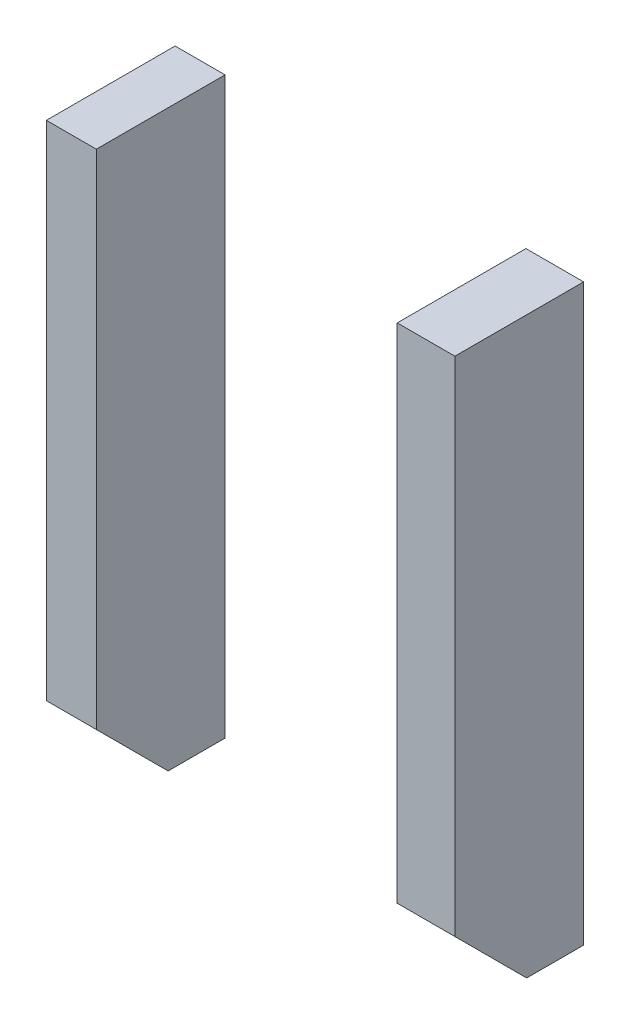
ISO-10303-21;
HEADER;
FILE_DESCRIPTION(('STEP AP214'),'2;1');
FILE_NAME('part.step','',(''),(''),'','','');
FILE_SCHEMA(('AUTOMOTIVE_DESIGN { 1 0 10303 214 1 1 1 1 }'));
ENDSEC;
DATA;
#1=APPLICATION_CONTEXT('core data for automotive mechanical design processes');
#2=APPLICATION_PROTOCOL_DEFINITION('international standard','automotive_design',2000,#1);
#3=PRODUCT_CONTEXT('',#1,'mechanical');
#4=PRODUCT('Part','Part','',(#3));
#5=PRODUCT_RELATED_PRODUCT_CATEGORY('part','',(#4));
#6=PRODUCT_DEFINITION_FORMATION('','',#4);
#7=PRODUCT_DEFINITION_CONTEXT('part definition',#1,'design');
#8=PRODUCT_DEFINITION('design','',#6,#7);
#9=PRODUCT_DEFINITION_SHAPE('','',#8);
#10=(LENGTH_UNIT() NAMED_UNIT(*) SI_UNIT(.MILLI.,.METRE.));
#11=(NAMED_UNIT(*) PLANE_ANGLE_UNIT() SI_UNIT($,.RADIAN.));
#12=(NAMED_UNIT(*) SI_UNIT($,.STERADIAN.) SOLID_ANGLE_UNIT());
#13=UNCERTAINTY_MEASURE_WITH_UNIT(LENGTH_MEASURE(1.E-05),#10,'distance_accuracy_value','');
#14=(GEOMETRIC_REPRESENTATION_CONTEXT(3) GLOBAL_UNCERTAINTY_ASSIGNED_CONTEXT((#13)) GLOBAL_UNIT_ASSIGNED_CONTEXT((#10,
#11,#12)) REPRESENTATION_CONTEXT('',''));
#15=CARTESIAN_POINT('',(0.,0.,0.));
#16=DIRECTION('',(0.,0.,1.));
#17=DIRECTION('',(1.,0.,0.));
#18=AXIS2_PLACEMENT_3D('',#15,#16,#17);
#19=CARTESIAN_POINT('',(12.239389471199,-15.92500066,0.612040665006));
#20=DIRECTION('',(1.,0.,0.));
#21=DIRECTION('',(0.,0.,-1.));
#22=AXIS2_PLACEMENT_3D('',#19,#20,#21);
#23=PLANE('',#22);
#24=DIRECTION('',(0.,0.,-1.));
#25=VECTOR('',#24,1.);
#26=CARTESIAN_POINT('',(12.239389471199,-15.92500066,0.839762895333));
#27=LINE('',#26,#25);
#28=CARTESIAN_POINT('',(12.239389471199,-15.92500066,0.612040665006));
#29=VERTEX_POINT('',#28);
#30=CARTESIAN_POINT('',(12.239389471199,-15.92500066,1.067485125659));
#31=VERTEX_POINT('',#30);
#32=EDGE_CURVE('P0_E62',#29,#31,#27,.F.);
#33=ORIENTED_EDGE('',*,*,#32,.T.);
#34=DIRECTION('',(0.,-1.,0.));
#35=VECTOR('',#34,1.);
#36=CARTESIAN_POINT('',(12.239389471199,-15.92500066,1.067485125659));
#37=LINE('',#36,#35);
#38=CARTESIAN_POINT('',(12.239389471199,-17.70300066,1.067485125659));
#39=VERTEX_POINT('',#38);
#40=EDGE_CURVE('P0_E75',#39,#31,#37,.F.);
#41=ORIENTED_EDGE('',*,*,#40,.F.);
#42=DIRECTION('',(0.,-0.707106781186548,-0.707106781186548));
#43=VECTOR('',#42,1.);
#44=CARTESIAN_POINT('',(12.239389471199,-17.83000066,0.940485125659));
#45=LINE('',#44,#43);
#46=CARTESIAN_POINT('',(12.239389471199,-17.95700066,0.813485125659));
#47=VERTEX_POINT('',#46);
#48=EDGE_CURVE('P0_E68',#47,#39,#45,.F.);
#49=ORIENTED_EDGE('',*,*,#48,.F.);
#50=DIRECTION('',(0.,0.,-1.));
#51=VECTOR('',#50,1.);
#52=CARTESIAN_POINT('',(12.239389471199,-17.95700066,0.612040665006));
#53=LINE('',#52,#51);
#54=CARTESIAN_POINT('',(12.239389471199,-17.95700066,0.612040665006));
#55=VERTEX_POINT('',#54);
#56=EDGE_CURVE('P0_E20',#47,#55,#53,.T.);
#57=ORIENTED_EDGE('',*,*,#56,.T.);
#58=DIRECTION('',(0.,1.,0.));
#59=VECTOR('',#58,1.);
#60=CARTESIAN_POINT('',(12.239389471199,-15.92500066,0.612040665006));
#61=LINE('',#60,#59);
#62=EDGE_CURVE('P0_E91',#29,#55,#61,.F.);
#63=ORIENTED_EDGE('',*,*,#62,.F.);
#64=EDGE_LOOP('',(#33,#41,#49,#57,#63));
#65=FACE_BOUND('',#64,.T.);
#66=ADVANCED_FACE('P0_F17',(#65),#23,.T.);
#67=CARTESIAN_POINT('',(12.188389178134,-17.83000066,0.940485125659));
#68=DIRECTION('',(0.,-0.707106781186548,0.707106781186548));
#69=DIRECTION('',(0.,-0.707106781186548,-0.707106781186548));
#70=AXIS2_PLACEMENT_3D('',#67,#68,#69);
#71=PLANE('',#70);
#72=ORIENTED_EDGE('',*,*,#48,.T.);
#73=DIRECTION('',(1.,0.,0.));
#74=VECTOR('',#73,1.);
#75=CARTESIAN_POINT('',(12.239389471199,-17.70300066,1.067485125659));
#76=LINE('',#75,#74);
#77=CARTESIAN_POINT('',(12.03538829894,-17.70300066,1.067485125659));
#78=VERTEX_POINT('',#77);
#79=EDGE_CURVE('P0_E71',#78,#39,#76,.T.);
#80=ORIENTED_EDGE('',*,*,#79,.F.);
#81=DIRECTION('',(0.,0.707106781186544,0.707106781186551));
#82=VECTOR('',#81,1.);
#83=CARTESIAN_POINT('',(12.03538829894,-17.95700066,0.813485125659));
#84=LINE('',#83,#82);
#85=CARTESIAN_POINT('',(12.03538829894,-17.95700066,0.813485125659001));
#86=VERTEX_POINT('',#85);
#87=EDGE_CURVE('P0_E95',#86,#78,#84,.T.);
#88=ORIENTED_EDGE('',*,*,#87,.F.);
#89=DIRECTION('',(1.,0.,0.));
#90=VECTOR('',#89,1.);
#91=CARTESIAN_POINT('',(12.13738888507,-17.95700066,0.813485125659));
#92=LINE('',#91,#90);
#93=EDGE_CURVE('P0_E74',#47,#86,#92,.F.);
#94=ORIENTED_EDGE('',*,*,#93,.F.);
#95=EDGE_LOOP('',(#72,#80,#88,#94));
#96=FACE_BOUND('',#95,.T.);
#97=ADVANCED_FACE('P0_F69',(#96),#71,.T.);
#98=CARTESIAN_POINT('',(12.239389471199,-15.92500066,1.067485125659));
#99=DIRECTION('',(0.,0.,1.));
#100=DIRECTION('',(0.,-1.,0.));
#101=AXIS2_PLACEMENT_3D('',#98,#99,#100);
#102=PLANE('',#101);
#103=DIRECTION('',(1.,0.,0.));
#104=VECTOR('',#103,1.);
#105=CARTESIAN_POINT('',(12.13738888507,-15.92500066,1.067485125659));
#106=LINE('',#105,#104);
#107=CARTESIAN_POINT('',(12.03538829894,-15.92500066,1.067485125659));
#108=VERTEX_POINT('',#107);
#109=EDGE_CURVE('P0_E86',#31,#108,#106,.F.);
#110=ORIENTED_EDGE('',*,*,#109,.T.);
#111=DIRECTION('',(0.,1.,0.));
#112=VECTOR('',#111,1.);
#113=CARTESIAN_POINT('',(12.03538829894,-15.92500066,1.067485125659));
#114=LINE('',#113,#112);
#115=EDGE_CURVE('P0_E81',#78,#108,#114,.T.);
#116=ORIENTED_EDGE('',*,*,#115,.F.);
#117=ORIENTED_EDGE('',*,*,#79,.T.);
#118=ORIENTED_EDGE('',*,*,#40,.T.);
#119=EDGE_LOOP('',(#110,#116,#117,#118));
#120=FACE_BOUND('',#119,.T.);
#121=ADVANCED_FACE('P0_F79',(#120),#102,.T.);
#122=CARTESIAN_POINT('',(12.13738888507,-15.92500066,0.839762895333));
#123=DIRECTION('',(0.,-1.,0.));
#124=DIRECTION('',(0.,0.,-1.));
#125=AXIS2_PLACEMENT_3D('',#122,#123,#124);
#126=PLANE('',#125);
#127=ORIENTED_EDGE('',*,*,#32,.F.);
#128=DIRECTION('',(1.,0.,0.));
#129=VECTOR('',#128,1.);
#130=CARTESIAN_POINT('',(12.03538829894,-15.92500066,0.612040665006));
#131=LINE('',#130,#129);
#132=CARTESIAN_POINT('',(12.03538829894,-15.92500066,0.612040665006));
#133=VERTEX_POINT('',#132);
#134=EDGE_CURVE('P0_E88',#133,#29,#131,.T.);
#135=ORIENTED_EDGE('',*,*,#134,.F.);
#136=DIRECTION('',(0.,0.,1.));
#137=VECTOR('',#136,1.);
#138=CARTESIAN_POINT('',(12.03538829894,-15.92500066,1.067485125659));
#139=LINE('',#138,#137);
#140=EDGE_CURVE('P0_E98',#108,#133,#139,.F.);
#141=ORIENTED_EDGE('',*,*,#140,.F.);
#142=ORIENTED_EDGE('',*,*,#109,.F.);
#143=EDGE_LOOP('',(#127,#135,#141,#142));
#144=FACE_BOUND('',#143,.T.);
#145=ADVANCED_FACE('P0_F107',(#144),#126,.F.);
#146=CARTESIAN_POINT('',(12.03538829894,-15.92500066,0.612040665006));
#147=DIRECTION('',(0.,0.,-1.));
#148=DIRECTION('',(0.,1.,0.));
#149=AXIS2_PLACEMENT_3D('',#146,#147,#148);
#150=PLANE('',#149);
#151=DIRECTION('',(1.,0.,0.));
#152=VECTOR('',#151,1.);
#153=CARTESIAN_POINT('',(12.13738888507,-17.95700066,0.612040665006));
#154=LINE('',#153,#152);
#155=CARTESIAN_POINT('',(12.03538829894,-17.95700066,0.612040665006));
#156=VERTEX_POINT('',#155);
#157=EDGE_CURVE('P0_E35',#156,#55,#154,.T.);
#158=ORIENTED_EDGE('',*,*,#157,.F.);
#159=DIRECTION('',(0.,1.,0.));
#160=VECTOR('',#159,1.);
#161=CARTESIAN_POINT('',(12.03538829894,-15.92500066,0.612040665006));
#162=LINE('',#161,#160);
#163=EDGE_CURVE('P0_E26',#133,#156,#162,.F.);
#164=ORIENTED_EDGE('',*,*,#163,.F.);
#165=ORIENTED_EDGE('',*,*,#134,.T.);
#166=ORIENTED_EDGE('',*,*,#62,.T.);
#167=EDGE_LOOP('',(#158,#164,#165,#166));
#168=FACE_BOUND('',#167,.T.);
#169=ADVANCED_FACE('P0_F105',(#168),#150,.T.);
#170=CARTESIAN_POINT('',(12.13738888507,-17.95700066,0.839762895333));
#171=DIRECTION('',(0.,-1.,0.));
#172=DIRECTION('',(0.,0.,-1.));
#173=AXIS2_PLACEMENT_3D('',#170,#171,#172);
#174=PLANE('',#173);
#175=ORIENTED_EDGE('',*,*,#157,.T.);
#176=ORIENTED_EDGE('',*,*,#56,.F.);
#177=ORIENTED_EDGE('',*,*,#93,.T.);
#178=DIRECTION('',(0.,0.,1.));
#179=VECTOR('',#178,1.);
#180=CARTESIAN_POINT('',(12.03538829894,-17.95700066,1.067485125659));
#181=LINE('',#180,#179);
#182=EDGE_CURVE('P0_E11',#156,#86,#181,.T.);
#183=ORIENTED_EDGE('',*,*,#182,.F.);
#184=EDGE_LOOP('',(#175,#176,#177,#183));
#185=FACE_BOUND('',#184,.T.);
#186=ADVANCED_FACE('P0_F109',(#185),#174,.T.);
#187=CARTESIAN_POINT('',(12.03538829894,-15.92500066,1.067485125659));
#188=DIRECTION('',(-1.,0.,0.));
#189=DIRECTION('',(0.,0.,1.));
#190=AXIS2_PLACEMENT_3D('',#187,#188,#189);
#191=PLANE('',#190);
#192=ORIENTED_EDGE('',*,*,#163,.T.);
#193=ORIENTED_EDGE('',*,*,#182,.T.);
#194=ORIENTED_EDGE('',*,*,#87,.T.);
#195=ORIENTED_EDGE('',*,*,#115,.T.);
#196=ORIENTED_EDGE('',*,*,#140,.T.);
#197=EDGE_LOOP('',(#192,#193,#194,#195,#196));
#198=FACE_BOUND('',#197,.T.);
#199=ADVANCED_FACE('P0_F103',(#198),#191,.T.);
#200=CLOSED_SHELL('',(#66,#97,#121,#145,#169,#186,#199));
#201=MANIFOLD_SOLID_BREP('P0_B1',#200);
#202=CARTESIAN_POINT('',(10.97095600492,-15.92500066,0.612040665006));
#203=DIRECTION('',(1.,0.,0.));
#204=DIRECTION('',(0.,0.,-1.));
#205=AXIS2_PLACEMENT_3D('',#202,#203,#204);
#206=PLANE('',#205);
#207=DIRECTION('',(0.,0.,-1.));
#208=VECTOR('',#207,1.);
#209=CARTESIAN_POINT('',(10.97095600492,-15.92500066,0.839762895333));
#210=LINE('',#209,#208);
#211=CARTESIAN_POINT('',(10.97095600492,-15.92500066,0.612040665006));
#212=VERTEX_POINT('',#211);
#213=CARTESIAN_POINT('',(10.97095600492,-15.92500066,1.067485125659));
#214=VERTEX_POINT('',#213);
#215=EDGE_CURVE('P1_E62',#212,#214,#210,.F.);
#216=ORIENTED_EDGE('',*,*,#215,.T.);
#217=DIRECTION('',(0.,-1.,0.));
#218=VECTOR('',#217,1.);
#219=CARTESIAN_POINT('',(10.97095600492,-15.92500066,1.067485125659));
#220=LINE('',#219,#218);
#221=CARTESIAN_POINT('',(10.97095600492,-17.70300066,1.067485125659));
#222=VERTEX_POINT('',#221);
#223=EDGE_CURVE('P1_E75',#222,#214,#220,.F.);
#224=ORIENTED_EDGE('',*,*,#223,.F.);
#225=DIRECTION('',(0.,-0.707106781186548,-0.707106781186548));
#226=VECTOR('',#225,1.);
#227=CARTESIAN_POINT('',(10.97095600492,-17.83000066,0.940485125659));
#228=LINE('',#227,#226);
#229=CARTESIAN_POINT('',(10.97095600492,-17.95700066,0.813485125659));
#230=VERTEX_POINT('',#229);
#231=EDGE_CURVE('P1_E68',#230,#222,#228,.F.);
#232=ORIENTED_EDGE('',*,*,#231,.F.);
#233=DIRECTION('',(0.,0.,-1.));
#234=VECTOR('',#233,1.);
#235=CARTESIAN_POINT('',(10.97095600492,-17.95700066,0.612040665006));
#236=LINE('',#235,#234);
#237=CARTESIAN_POINT('',(10.97095600492,-17.95700066,0.612040665006));
#238=VERTEX_POINT('',#237);
#239=EDGE_CURVE('P1_E20',#230,#238,#236,.T.);
#240=ORIENTED_EDGE('',*,*,#239,.T.);
#241=DIRECTION('',(0.,1.,0.));
#242=VECTOR('',#241,1.);
#243=CARTESIAN_POINT('',(10.97095600492,-15.92500066,0.612040665006));
#244=LINE('',#243,#242);
#245=EDGE_CURVE('P1_E91',#212,#238,#244,.F.);
#246=ORIENTED_EDGE('',*,*,#245,.F.);
#247=EDGE_LOOP('',(#216,#224,#232,#240,#246));
#248=FACE_BOUND('',#247,.T.);
#249=ADVANCED_FACE('P1_F17',(#248),#206,.T.);
#250=CARTESIAN_POINT('',(10.92676278382,-17.83000066,0.940485125659));
#251=DIRECTION('',(0.,-0.707106781186548,0.707106781186548));
#252=DIRECTION('',(0.,-0.707106781186548,-0.707106781186548));
#253=AXIS2_PLACEMENT_3D('',#250,#251,#252);
#254=PLANE('',#253);
#255=ORIENTED_EDGE('',*,*,#231,.T.);
#256=DIRECTION('',(1.,0.,0.));
#257=VECTOR('',#256,1.);
#258=CARTESIAN_POINT('',(10.97095600492,-17.70300066,1.067485125659));
#259=LINE('',#258,#257);
#260=CARTESIAN_POINT('',(10.794183120519,-17.70300066,1.067485125659));
#261=VERTEX_POINT('',#260);
#262=EDGE_CURVE('P1_E71',#261,#222,#259,.T.);
#263=ORIENTED_EDGE('',*,*,#262,.F.);
#264=DIRECTION('',(0.,0.707106781186544,0.707106781186551));
#265=VECTOR('',#264,1.);
#266=CARTESIAN_POINT('',(10.794183120519,-17.95700066,0.813485125659));
#267=LINE('',#266,#265);
#268=CARTESIAN_POINT('',(10.794183120519,-17.95700066,0.813485125659001));
#269=VERTEX_POINT('',#268);
#270=EDGE_CURVE('P1_E95',#269,#261,#267,.T.);
#271=ORIENTED_EDGE('',*,*,#270,.F.);
#272=DIRECTION('',(1.,0.,0.));
#273=VECTOR('',#272,1.);
#274=CARTESIAN_POINT('',(10.88256956272,-17.95700066,0.813485125659));
#275=LINE('',#274,#273);
#276=EDGE_CURVE('P1_E74',#230,#269,#275,.F.);
#277=ORIENTED_EDGE('',*,*,#276,.F.);
#278=EDGE_LOOP('',(#255,#263,#271,#277));
#279=FACE_BOUND('',#278,.T.);
#280=ADVANCED_FACE('P1_F69',(#279),#254,.T.);
#281=CARTESIAN_POINT('',(10.97095600492,-15.92500066,1.067485125659));
#282=DIRECTION('',(0.,0.,1.));
#283=DIRECTION('',(0.,-1.,0.));
#284=AXIS2_PLACEMENT_3D('',#281,#282,#283);
#285=PLANE('',#284);
#286=DIRECTION('',(1.,0.,0.));
#287=VECTOR('',#286,1.);
#288=CARTESIAN_POINT('',(10.88256956272,-15.92500066,1.067485125659));
#289=LINE('',#288,#287);
#290=CARTESIAN_POINT('',(10.794183120519,-15.92500066,1.067485125659));
#291=VERTEX_POINT('',#290);
#292=EDGE_CURVE('P1_E86',#214,#291,#289,.F.);
#293=ORIENTED_EDGE('',*,*,#292,.T.);
#294=DIRECTION('',(0.,1.,0.));
#295=VECTOR('',#294,1.);
#296=CARTESIAN_POINT('',(10.794183120519,-15.92500066,1.067485125659));
#297=LINE('',#296,#295);
#298=EDGE_CURVE('P1_E81',#261,#291,#297,.T.);
#299=ORIENTED_EDGE('',*,*,#298,.F.);
#300=ORIENTED_EDGE('',*,*,#262,.T.);
#301=ORIENTED_EDGE('',*,*,#223,.T.);
#302=EDGE_LOOP('',(#293,#299,#300,#301));
#303=FACE_BOUND('',#302,.T.);
#304=ADVANCED_FACE('P1_F79',(#303),#285,.T.);
#305=CARTESIAN_POINT('',(10.88256956272,-15.92500066,0.839762895333));
#306=DIRECTION('',(0.,-1.,0.));
#307=DIRECTION('',(0.,0.,-1.));
#308=AXIS2_PLACEMENT_3D('',#305,#306,#307);
#309=PLANE('',#308);
#310=ORIENTED_EDGE('',*,*,#215,.F.);
#311=DIRECTION('',(1.,0.,0.));
#312=VECTOR('',#311,1.);
#313=CARTESIAN_POINT('',(10.794183120519,-15.92500066,0.612040665006));
#314=LINE('',#313,#312);
#315=CARTESIAN_POINT('',(10.794183120519,-15.92500066,0.612040665006));
#316=VERTEX_POINT('',#315);
#317=EDGE_CURVE('P1_E88',#316,#212,#314,.T.);
#318=ORIENTED_EDGE('',*,*,#317,.F.);
#319=DIRECTION('',(0.,0.,1.));
#320=VECTOR('',#319,1.);
#321=CARTESIAN_POINT('',(10.794183120519,-15.92500066,1.067485125659));
#322=LINE('',#321,#320);
#323=EDGE_CURVE('P1_E98',#291,#316,#322,.F.);
#324=ORIENTED_EDGE('',*,*,#323,.F.);
#325=ORIENTED_EDGE('',*,*,#292,.F.);
#326=EDGE_LOOP('',(#310,#318,#324,#325));
#327=FACE_BOUND('',#326,.T.);
#328=ADVANCED_FACE('P1_F107',(#327),#309,.F.);
#329=CARTESIAN_POINT('',(10.794183120519,-15.92500066,0.612040665006));
#330=DIRECTION('',(0.,0.,-1.));
#331=DIRECTION('',(0.,1.,0.));
#332=AXIS2_PLACEMENT_3D('',#329,#330,#331);
#333=PLANE('',#332);
#334=DIRECTION('',(1.,0.,0.));
#335=VECTOR('',#334,1.);
#336=CARTESIAN_POINT('',(10.88256956272,-17.95700066,0.612040665006));
#337=LINE('',#336,#335);
#338=CARTESIAN_POINT('',(10.794183120519,-17.95700066,0.612040665006));
#339=VERTEX_POINT('',#338);
#340=EDGE_CURVE('P1_E35',#339,#238,#337,.T.);
#341=ORIENTED_EDGE('',*,*,#340,.F.);
#342=DIRECTION('',(0.,1.,0.));
#343=VECTOR('',#342,1.);
#344=CARTESIAN_POINT('',(10.794183120519,-15.92500066,0.612040665006));
#345=LINE('',#344,#343);
#346=EDGE_CURVE('P1_E26',#316,#339,#345,.F.);
#347=ORIENTED_EDGE('',*,*,#346,.F.);
#348=ORIENTED_EDGE('',*,*,#317,.T.);
#349=ORIENTED_EDGE('',*,*,#245,.T.);
#350=EDGE_LOOP('',(#341,#347,#348,#349));
#351=FACE_BOUND('',#350,.T.);
#352=ADVANCED_FACE('P1_F105',(#351),#333,.T.);
#353=CARTESIAN_POINT('',(10.88256956272,-17.95700066,0.839762895333));
#354=DIRECTION('',(0.,-1.,0.));
#355=DIRECTION('',(0.,0.,-1.));
#356=AXIS2_PLACEMENT_3D('',#353,#354,#355);
#357=PLANE('',#356);
#358=ORIENTED_EDGE('',*,*,#340,.T.);
#359=ORIENTED_EDGE('',*,*,#239,.F.);
#360=ORIENTED_EDGE('',*,*,#276,.T.);
#361=DIRECTION('',(0.,0.,1.));
#362=VECTOR('',#361,1.);
#363=CARTESIAN_POINT('',(10.794183120519,-17.95700066,1.067485125659));
#364=LINE('',#363,#362);
#365=EDGE_CURVE('P1_E11',#339,#269,#364,.T.);
#366=ORIENTED_EDGE('',*,*,#365,.F.);
#367=EDGE_LOOP('',(#358,#359,#360,#366));
#368=FACE_BOUND('',#367,.T.);
#369=ADVANCED_FACE('P1_F109',(#368),#357,.T.);
#370=CARTESIAN_POINT('',(10.794183120519,-15.92500066,1.067485125659));
#371=DIRECTION('',(-1.,0.,0.));
#372=DIRECTION('',(0.,0.,1.));
#373=AXIS2_PLACEMENT_3D('',#370,#371,#372);
#374=PLANE('',#373);
#375=ORIENTED_EDGE('',*,*,#346,.T.);
#376=ORIENTED_EDGE('',*,*,#365,.T.);
#377=ORIENTED_EDGE('',*,*,#270,.T.);
#378=ORIENTED_EDGE('',*,*,#298,.T.);
#379=ORIENTED_EDGE('',*,*,#323,.T.);
#380=EDGE_LOOP('',(#375,#376,#377,#378,#379));
#381=FACE_BOUND('',#380,.T.);
#382=ADVANCED_FACE('P1_F103',(#381),#374,.T.);
#383=CLOSED_SHELL('',(#249,#280,#304,#328,#352,#369,#382));
#384=MANIFOLD_SOLID_BREP('P1_B1',#383);
#385=ADVANCED_BREP_SHAPE_REPRESENTATION('',(#18,#201,#384),#14);
#386=SHAPE_DEFINITION_REPRESENTATION(#9,#385);
ENDSEC;
END-ISO-10303-21;
